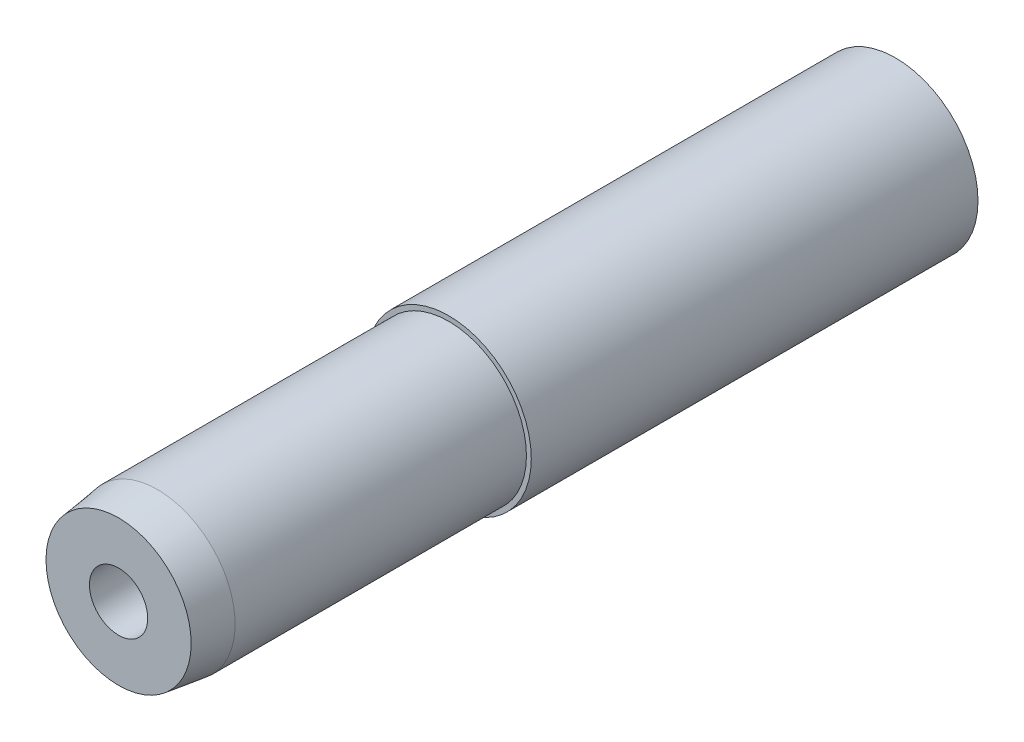
ISO-10303-21;
HEADER;
FILE_DESCRIPTION(('STEP AP214'),'2;1');
FILE_NAME('part.step','',(''),(''),'','','');
FILE_SCHEMA(('AUTOMOTIVE_DESIGN { 1 0 10303 214 1 1 1 1 }'));
ENDSEC;
DATA;
#1=APPLICATION_CONTEXT('core data for automotive mechanical design processes');
#2=APPLICATION_PROTOCOL_DEFINITION('international standard','automotive_design',2000,#1);
#3=PRODUCT_CONTEXT('',#1,'mechanical');
#4=PRODUCT('Part','Part','',(#3));
#5=PRODUCT_RELATED_PRODUCT_CATEGORY('part','',(#4));
#6=PRODUCT_DEFINITION_FORMATION('','',#4);
#7=PRODUCT_DEFINITION_CONTEXT('part definition',#1,'design');
#8=PRODUCT_DEFINITION('design','',#6,#7);
#9=PRODUCT_DEFINITION_SHAPE('','',#8);
#10=(LENGTH_UNIT() NAMED_UNIT(*) SI_UNIT(.MILLI.,.METRE.));
#11=(NAMED_UNIT(*) PLANE_ANGLE_UNIT() SI_UNIT($,.RADIAN.));
#12=(NAMED_UNIT(*) SI_UNIT($,.STERADIAN.) SOLID_ANGLE_UNIT());
#13=UNCERTAINTY_MEASURE_WITH_UNIT(LENGTH_MEASURE(1.E-05),#10,'distance_accuracy_value','');
#14=(GEOMETRIC_REPRESENTATION_CONTEXT(3) GLOBAL_UNCERTAINTY_ASSIGNED_CONTEXT((#13)) GLOBAL_UNIT_ASSIGNED_CONTEXT((#10,
#11,#12)) REPRESENTATION_CONTEXT('',''));
#15=CARTESIAN_POINT('',(0.,0.,0.));
#16=DIRECTION('',(0.,0.,1.));
#17=DIRECTION('',(1.,0.,0.));
#18=AXIS2_PLACEMENT_3D('',#15,#16,#17);
#19=CARTESIAN_POINT('',(0.,0.,80.));
#20=DIRECTION('',(0.,0.,-1.));
#21=DIRECTION('',(-1.,0.,0.));
#22=AXIS2_PLACEMENT_3D('',#19,#20,#21);
#23=CYLINDRICAL_SURFACE('',#22,8.);
#24=CARTESIAN_POINT('',(0.,0.,46.));
#25=DIRECTION('',(0.,0.,1.));
#26=DIRECTION('',(1.,0.,0.));
#27=AXIS2_PLACEMENT_3D('',#24,#25,#26);
#28=CIRCLE('',#27,8.);
#29=CARTESIAN_POINT('',(8.,0.,46.));
#30=VERTEX_POINT('',#29);
#31=EDGE_CURVE('E116',#30,#30,#28,.T.);
#32=ORIENTED_EDGE('',*,*,#31,.T.);
#33=EDGE_LOOP('',(#32));
#34=FACE_BOUND('',#33,.T.);
#35=CARTESIAN_POINT('',(-5.5,5.80947501931113,75.25));
#36=CARTESIAN_POINT('',(-5.4999973647925,5.80947658831576,75.2724446367658));
#37=CARTESIAN_POINT('',(-5.50075632621254,5.80875906671293,75.2948762557681));
#38=CARTESIAN_POINT('',(-5.50376543930061,5.80590841523433,75.3395358589933));
#39=CARTESIAN_POINT('',(-5.50601472108675,5.8037761111489,75.3617639543419));
#40=CARTESIAN_POINT('',(-5.51490417097432,5.7953344714022,75.4275662420129));
#41=CARTESIAN_POINT('',(-5.52368708601938,5.78697955540515,75.4706196402466));
#42=CARTESIAN_POINT('',(-5.54631858939585,5.76529183890183,75.5539009904716));
#43=CARTESIAN_POINT('',(-5.56015731154863,5.75196873255287,75.594134264773));
#44=CARTESIAN_POINT('',(-5.59205062697002,5.72096716449756,75.6711529417533));
#45=CARTESIAN_POINT('',(-5.6101128100044,5.70328085872126,75.7079319682013));
#46=CARTESIAN_POINT('',(-5.65626082621989,5.65756897214208,75.7894272735963));
#47=CARTESIAN_POINT('',(-5.68566420753115,5.62807445098651,75.8325717520733));
#48=CARTESIAN_POINT('',(-5.74839334346837,5.5639909502419,75.9115441060554));
#49=CARTESIAN_POINT('',(-5.78172393019709,5.52939568117344,75.9473628164621));
#50=CARTESIAN_POINT('',(-5.86460775958792,5.44162744215559,76.0250311997331));
#51=CARTESIAN_POINT('',(-5.91529932689124,5.38657419925756,76.0635237072452));
#52=CARTESIAN_POINT('',(-6.01847367949334,5.27105509703498,76.1285637993737));
#53=CARTESIAN_POINT('',(-6.07096342133354,5.2105662805385,76.1550575636223));
#54=CARTESIAN_POINT('',(-6.15571574808617,5.10976620097672,76.1895141315093));
#55=CARTESIAN_POINT('',(-6.18805464688915,5.07056202152812,76.2006904605034));
#56=CARTESIAN_POINT('',(-6.25240238325326,4.99099992871494,76.2194427810981));
#57=CARTESIAN_POINT('',(-6.28441103650216,4.95064141398102,76.2270168584481));
#58=CARTESIAN_POINT('',(-6.34744619222707,4.86955122263275,76.2388089344467));
#59=CARTESIAN_POINT('',(-6.37848005531457,4.82883123783663,76.2430693267744));
#60=CARTESIAN_POINT('',(-6.43981305779877,4.74672940593479,76.2486592246154));
#61=CARTESIAN_POINT('',(-6.47011316396406,4.70534856402822,76.2499928204323));
#62=CARTESIAN_POINT('',(-6.5,4.66368952654441,76.25));
#63=B_SPLINE_CURVE_WITH_KNOTS('',3,(#35,#36,#37,#38,#39,#40,#41,#42,#43,#44,#45,#46,#47,#48,#49,
#50,#51,#52,#53,#54,#55,#56,#57,#58,#59,#60,#61,#62),.UNSPECIFIED.,.F.,.F.,(4,2,2,2,2,2,2,2,2,2,
2,2,2,4),(0.,0.0672846939769787,0.134530149251682,0.267953738167259,0.401118335746273,
0.534524101134662,0.713434469080135,0.89256731661171,1.14365776870358,1.39586359545443,
1.55184181425489,1.70790282813128,1.86193284181685,2.01574745555464),.UNSPECIFIED.);
#64=CARTESIAN_POINT('',(-5.5,5.80947501931113,75.25));
#65=VERTEX_POINT('',#64);
#66=CARTESIAN_POINT('',(-5.83856217223385,5.46911252041499,76.));
#67=VERTEX_POINT('',#66);
#68=EDGE_CURVE('E149',#65,#67,#63,.T.);
#69=ORIENTED_EDGE('',*,*,#68,.T.);
#70=CARTESIAN_POINT('',(0.,0.,76.));
#71=DIRECTION('',(0.,0.,1.));
#72=DIRECTION('',(1.,0.,0.));
#73=AXIS2_PLACEMENT_3D('',#70,#71,#72);
#74=CIRCLE('',#73,8.);
#75=CARTESIAN_POINT('',(-5.83856217223385,-5.46911252041499,76.));
#76=VERTEX_POINT('',#75);
#77=EDGE_CURVE('E188',#67,#76,#74,.F.);
#78=ORIENTED_EDGE('',*,*,#77,.T.);
#79=CARTESIAN_POINT('',(-6.5,-4.66368952654441,76.25));
#80=CARTESIAN_POINT('',(-6.46083609057357,-4.71828907133576,76.2499787062808));
#81=CARTESIAN_POINT('',(-6.42093978679341,-4.77242759041314,76.2476955807502));
#82=CARTESIAN_POINT('',(-6.33985607230395,-4.87962342509187,76.2379482765124));
#83=CARTESIAN_POINT('',(-6.29866369736904,-4.93267484247683,76.2304610385371));
#84=CARTESIAN_POINT('',(-6.21489914513631,-5.03781893417603,76.2094820524937));
#85=CARTESIAN_POINT('',(-6.17231555926465,-5.08988563380799,76.1959027011659));
#86=CARTESIAN_POINT('',(-6.0870690509846,-5.19152910468347,76.1619156028716));
#87=CARTESIAN_POINT('',(-6.04440647263203,-5.24111078346858,76.1415219777241));
#88=CARTESIAN_POINT('',(-5.96064244666235,-5.33616684258341,76.0934342739333));
#89=CARTESIAN_POINT('',(-5.91952674136761,-5.38170145652273,76.0658866075317));
#90=CARTESIAN_POINT('',(-5.83946717646799,-5.46846269991221,76.0025214948016));
#91=CARTESIAN_POINT('',(-5.80051520527707,-5.50970600842134,75.9667379468042));
#92=CARTESIAN_POINT('',(-5.73266647900596,-5.58019010290523,75.8928674655147));
#93=CARTESIAN_POINT('',(-5.70317492404397,-5.61028621403409,75.8561538839581));
#94=CARTESIAN_POINT('',(-5.64834718922158,-5.66548186253002,75.7763304058402));
#95=CARTESIAN_POINT('',(-5.62300848999039,-5.69058443126945,75.7332244177589));
#96=CARTESIAN_POINT('',(-5.58253707774358,-5.73026413770207,75.6499682632775));
#97=CARTESIAN_POINT('',(-5.56637885103154,-5.74593687067846,75.6108410796674));
#98=CARTESIAN_POINT('',(-5.53887387819063,-5.7724554570499,75.5294188706917));
#99=CARTESIAN_POINT('',(-5.5275182346051,-5.78331023823785,75.4871298756682));
#100=CARTESIAN_POINT('',(-5.51273499936769,-5.79739856551107,75.4122924239087));
#101=CARTESIAN_POINT('',(-5.50798942726233,-5.80190366085101,75.3802361476641));
#102=CARTESIAN_POINT('',(-5.50160821950439,-5.8079524789656,75.3154639466623));
#103=CARTESIAN_POINT('',(-5.49998011332773,-5.80948903203296,75.2827466172152));
#104=CARTESIAN_POINT('',(-5.5,-5.80947501931113,75.25));
#105=B_SPLINE_CURVE_WITH_KNOTS('',3,(#79,#80,#81,#82,#83,#84,#85,#86,#87,#88,#89,#90,#91,#92,
#93,#94,#95,#96,#97,#98,#99,#100,#101,#102,#103,#104),.UNSPECIFIED.,.F.,.F.,(4,2,2,2,2,2,2,2,2,
2,2,2,4),(0.,0.201615295695545,0.404129685671124,0.609654475132622,0.814755952231671,
1.01595182800877,1.21633395327743,1.38338293916837,1.55033020499172,1.6852059036034,
1.81983061976126,1.91770691416532,2.01581930808139),.UNSPECIFIED.);
#106=CARTESIAN_POINT('',(-5.5,-5.80947501931113,75.25));
#107=VERTEX_POINT('',#106);
#108=EDGE_CURVE('E159',#76,#107,#105,.T.);
#109=ORIENTED_EDGE('',*,*,#108,.T.);
#110=DIRECTION('',(0.,0.,-1.));
#111=VECTOR('',#110,1.);
#112=CARTESIAN_POINT('',(-5.5,-5.80947501931113,80.));
#113=LINE('',#112,#111);
#114=CARTESIAN_POINT('',(-5.5,-5.80947501931113,52.));
#115=VERTEX_POINT('',#114);
#116=EDGE_CURVE('E127',#115,#107,#113,.F.);
#117=ORIENTED_EDGE('',*,*,#116,.F.);
#118=CARTESIAN_POINT('',(-5.5,-5.80947501931113,52.));
#119=CARTESIAN_POINT('',(-5.4999973647925,-5.80947658831575,51.9775553632342));
#120=CARTESIAN_POINT('',(-5.50075632621254,-5.80875906671292,51.9551237442319));
#121=CARTESIAN_POINT('',(-5.50376543930062,-5.80590841523432,51.9104641410067));
#122=CARTESIAN_POINT('',(-5.50601472108675,-5.8037761111489,51.8882360456581));
#123=CARTESIAN_POINT('',(-5.51490417097433,-5.7953344714022,51.8224337579871));
#124=CARTESIAN_POINT('',(-5.52368708601939,-5.78697955540514,51.7793803597534));
#125=CARTESIAN_POINT('',(-5.54631858939585,-5.76529183890183,51.6960990095284));
#126=CARTESIAN_POINT('',(-5.56015731154863,-5.75196873255287,51.655865735227));
#127=CARTESIAN_POINT('',(-5.59205062697003,-5.72096716449755,51.5788470582467));
#128=CARTESIAN_POINT('',(-5.61011281000441,-5.70328085872126,51.5420680317987));
#129=CARTESIAN_POINT('',(-5.65626082621989,-5.65756897214208,51.4605727264037));
#130=CARTESIAN_POINT('',(-5.68566420753115,-5.62807445098651,51.4174282479267));
#131=CARTESIAN_POINT('',(-5.74839334346838,-5.5639909502419,51.3384558939446));
#132=CARTESIAN_POINT('',(-5.78172393019709,-5.52939568117343,51.3026371835379));
#133=CARTESIAN_POINT('',(-5.86460775958793,-5.44162744215558,51.2249688002668));
#134=CARTESIAN_POINT('',(-5.91529932689125,-5.38657419925755,51.1864762927547));
#135=CARTESIAN_POINT('',(-6.01847367949335,-5.27105509703496,51.1214362006263));
#136=CARTESIAN_POINT('',(-6.07096342133355,-5.21056628053848,51.0949424363777));
#137=CARTESIAN_POINT('',(-6.15571574808618,-5.10976620097671,51.0604858684907));
#138=CARTESIAN_POINT('',(-6.18805464688916,-5.07056202152811,51.0493095394966));
#139=CARTESIAN_POINT('',(-6.25240238325327,-4.99099992871493,51.0305572189019));
#140=CARTESIAN_POINT('',(-6.28441103650216,-4.95064141398101,51.0229831415519));
#141=CARTESIAN_POINT('',(-6.34744619222707,-4.86955122263274,51.0111910655533));
#142=CARTESIAN_POINT('',(-6.37848005531458,-4.82883123783662,51.0069306732256));
#143=CARTESIAN_POINT('',(-6.43981305779878,-4.74672940593478,51.0013407753846));
#144=CARTESIAN_POINT('',(-6.47011316396407,-4.70534856402822,51.0000071795677));
#145=CARTESIAN_POINT('',(-6.5,-4.66368952654441,51.));
#146=B_SPLINE_CURVE_WITH_KNOTS('',3,(#118,#119,#120,#121,#122,#123,#124,#125,#126,#127,#128,
#129,#130,#131,#132,#133,#134,#135,#136,#137,#138,#139,#140,#141,#142,#143,#144,#145),
.UNSPECIFIED.,.F.,.F.,(4,2,2,2,2,2,2,2,2,2,2,2,2,4),(0.,0.0672846939769926,0.134530149251696,
0.26795373816726,0.401118335746267,0.534524101134662,0.713434469080133,0.892567316611714,
1.14365776870359,1.39586359545444,1.5518418142549,1.70790282813128,1.86193284181686,
2.01574745555464),.UNSPECIFIED.);
#147=CARTESIAN_POINT('',(-6.5,-4.66368952654441,51.));
#148=VERTEX_POINT('',#147);
#149=EDGE_CURVE('E201',#115,#148,#146,.T.);
#150=ORIENTED_EDGE('',*,*,#149,.T.);
#151=CARTESIAN_POINT('',(0.,0.,51.));
#152=DIRECTION('',(0.,0.,-1.));
#153=DIRECTION('',(-1.,0.,0.));
#154=AXIS2_PLACEMENT_3D('',#151,#152,#153);
#155=CIRCLE('',#154,8.);
#156=CARTESIAN_POINT('',(-6.5,4.66368952654441,51.));
#157=VERTEX_POINT('',#156);
#158=EDGE_CURVE('E119',#148,#157,#155,.T.);
#159=ORIENTED_EDGE('',*,*,#158,.T.);
#160=CARTESIAN_POINT('',(-6.5,4.66368952654441,51.));
#161=CARTESIAN_POINT('',(-6.46083609057357,4.71828907133576,51.0000212937192));
#162=CARTESIAN_POINT('',(-6.42093978679341,4.77242759041314,51.0023044192498));
#163=CARTESIAN_POINT('',(-6.33985607230395,4.87962342509187,51.0120517234876));
#164=CARTESIAN_POINT('',(-6.29866369736905,4.93267484247682,51.0195389614629));
#165=CARTESIAN_POINT('',(-6.21489914513631,5.03781893417603,51.0405179475063));
#166=CARTESIAN_POINT('',(-6.17231555926465,5.08988563380799,51.0540972988341));
#167=CARTESIAN_POINT('',(-6.08706905098461,5.19152910468347,51.0880843971284));
#168=CARTESIAN_POINT('',(-6.04440647263203,5.24111078346858,51.1084780222759));
#169=CARTESIAN_POINT('',(-5.96064244666236,5.33616684258341,51.1565657260667));
#170=CARTESIAN_POINT('',(-5.91952674136761,5.38170145652272,51.1841133924683));
#171=CARTESIAN_POINT('',(-5.839467176468,5.46846269991221,51.2474785051984));
#172=CARTESIAN_POINT('',(-5.80051520527707,5.50970600842133,51.2832620531958));
#173=CARTESIAN_POINT('',(-5.73266647900596,5.58019010290523,51.3571325344853));
#174=CARTESIAN_POINT('',(-5.70317492404397,5.61028621403408,51.3938461160419));
#175=CARTESIAN_POINT('',(-5.64834718922159,5.66548186253002,51.4736695941598));
#176=CARTESIAN_POINT('',(-5.62300848999039,5.69058443126945,51.5167755822411));
#177=CARTESIAN_POINT('',(-5.58253707774357,5.73026413770207,51.6000317367225));
#178=CARTESIAN_POINT('',(-5.56637885103154,5.74593687067847,51.6391589203326));
#179=CARTESIAN_POINT('',(-5.53887387819063,5.7724554570499,51.7205811293084));
#180=CARTESIAN_POINT('',(-5.5275182346051,5.78331023823785,51.7628701243319));
#181=CARTESIAN_POINT('',(-5.5127349993677,5.79739856551107,51.8377075760913));
#182=CARTESIAN_POINT('',(-5.50798942726233,5.80190366085101,51.8697638523359));
#183=CARTESIAN_POINT('',(-5.50160821950439,5.8079524789656,51.9345360533377));
#184=CARTESIAN_POINT('',(-5.49998011332773,5.80948903203296,51.9672533827848));
#185=CARTESIAN_POINT('',(-5.5,5.80947501931113,52.));
#186=B_SPLINE_CURVE_WITH_KNOTS('',3,(#160,#161,#162,#163,#164,#165,#166,#167,#168,#169,#170,
#171,#172,#173,#174,#175,#176,#177,#178,#179,#180,#181,#182,#183,#184,#185),.UNSPECIFIED.,.F.,
.F.,(4,2,2,2,2,2,2,2,2,2,2,2,4),(0.,0.201615295695545,0.404129685671123,0.609654475132619,
0.814755952231669,1.01595182800876,1.21633395327743,1.38338293916837,1.55033020499173,
1.68520590360344,1.81983061976128,1.91770691416533,2.01581930808141),.UNSPECIFIED.);
#187=CARTESIAN_POINT('',(-5.5,5.80947501931113,52.));
#188=VERTEX_POINT('',#187);
#189=EDGE_CURVE('E203',#157,#188,#186,.T.);
#190=ORIENTED_EDGE('',*,*,#189,.T.);
#191=DIRECTION('',(0.,0.,-1.));
#192=VECTOR('',#191,1.);
#193=CARTESIAN_POINT('',(-5.5,5.80947501931113,80.));
#194=LINE('',#193,#192);
#195=EDGE_CURVE('E131',#65,#188,#194,.T.);
#196=ORIENTED_EDGE('',*,*,#195,.F.);
#197=EDGE_LOOP('',(#69,#78,#109,#117,#150,#159,#190,#196));
#198=FACE_BOUND('',#197,.T.);
#199=ADVANCED_FACE('F47',(#34,#198),#23,.T.);
#200=CARTESIAN_POINT('',(0.,0.,70.0416305603426));
#201=DIRECTION('',(0.,0.,-1.));
#202=DIRECTION('',(-1.,0.,0.));
#203=AXIS2_PLACEMENT_3D('',#200,#201,#202);
#204=CYLINDRICAL_SURFACE('',#203,8.50000000000001);
#205=CARTESIAN_POINT('',(0.,0.,0.));
#206=DIRECTION('',(0.,0.,1.));
#207=DIRECTION('',(1.,0.,0.));
#208=AXIS2_PLACEMENT_3D('',#205,#206,#207);
#209=CIRCLE('',#208,8.50000000000001);
#210=CARTESIAN_POINT('',(8.50000000000001,0.,0.));
#211=VERTEX_POINT('',#210);
#212=EDGE_CURVE('E105',#211,#211,#209,.T.);
#213=ORIENTED_EDGE('',*,*,#212,.T.);
#214=EDGE_LOOP('',(#213));
#215=FACE_BOUND('',#214,.T.);
#216=CARTESIAN_POINT('',(0.,0.,46.));
#217=DIRECTION('',(0.,0.,1.));
#218=DIRECTION('',(1.,0.,0.));
#219=AXIS2_PLACEMENT_3D('',#216,#217,#218);
#220=CIRCLE('',#219,8.50000000000001);
#221=CARTESIAN_POINT('',(8.50000000000001,0.,46.));
#222=VERTEX_POINT('',#221);
#223=EDGE_CURVE('E111',#222,#222,#220,.T.);
#224=ORIENTED_EDGE('',*,*,#223,.F.);
#225=EDGE_LOOP('',(#224));
#226=FACE_BOUND('',#225,.T.);
#227=ADVANCED_FACE('F234',(#215,#226),#204,.T.);
#228=CARTESIAN_POINT('',(0.,0.,0.));
#229=DIRECTION('',(0.,0.,1.));
#230=DIRECTION('',(1.,0.,0.));
#231=AXIS2_PLACEMENT_3D('',#228,#229,#230);
#232=PLANE('',#231);
#233=ORIENTED_EDGE('',*,*,#212,.F.);
#234=EDGE_LOOP('',(#233));
#235=FACE_BOUND('',#234,.T.);
#236=ADVANCED_FACE('F230',(#235),#232,.F.);
#237=CARTESIAN_POINT('',(0.,0.,46.));
#238=DIRECTION('',(0.,0.,1.));
#239=DIRECTION('',(1.,0.,0.));
#240=AXIS2_PLACEMENT_3D('',#237,#238,#239);
#241=PLANE('',#240);
#242=ORIENTED_EDGE('',*,*,#31,.F.);
#243=EDGE_LOOP('',(#242));
#244=FACE_BOUND('',#243,.T.);
#245=ORIENTED_EDGE('',*,*,#223,.T.);
#246=EDGE_LOOP('',(#245));
#247=FACE_BOUND('',#246,.T.);
#248=ADVANCED_FACE('F174',(#244,#247),#241,.T.);
#249=CARTESIAN_POINT('',(0.,0.,80.));
#250=DIRECTION('',(0.,0.,1.));
#251=DIRECTION('',(1.,0.,0.));
#252=AXIS2_PLACEMENT_3D('',#249,#250,#251);
#253=PLANE('',#252);
#254=CARTESIAN_POINT('',(0.,0.,80.));
#255=DIRECTION('',(0.,0.,1.));
#256=DIRECTION('',(1.,0.,0.));
#257=AXIS2_PLACEMENT_3D('',#254,#255,#256);
#258=CIRCLE('',#257,3.);
#259=CARTESIAN_POINT('',(3.,0.,80.));
#260=VERTEX_POINT('',#259);
#261=EDGE_CURVE('E106',#260,#260,#258,.T.);
#262=ORIENTED_EDGE('',*,*,#261,.F.);
#263=EDGE_LOOP('',(#262));
#264=FACE_BOUND('',#263,.T.);
#265=CARTESIAN_POINT('',(0.,0.,80.));
#266=DIRECTION('',(0.,0.,1.));
#267=DIRECTION('',(1.,0.,0.));
#268=AXIS2_PLACEMENT_3D('',#265,#266,#267);
#269=CIRCLE('',#268,7.47339000965039);
#270=CARTESIAN_POINT('',(7.47339000965039,0.,80.));
#271=VERTEX_POINT('',#270);
#272=EDGE_CURVE('E198',#271,#271,#269,.T.);
#273=ORIENTED_EDGE('',*,*,#272,.T.);
#274=EDGE_LOOP('',(#273));
#275=FACE_BOUND('',#274,.T.);
#276=ADVANCED_FACE('F221',(#264,#275),#253,.T.);
#277=CARTESIAN_POINT('',(-5.50000000000001,-8.50000000000001,0.));
#278=DIRECTION('',(-1.,0.,0.));
#279=DIRECTION('',(0.,0.,1.));
#280=AXIS2_PLACEMENT_3D('',#277,#278,#279);
#281=PLANE('',#280);
#282=ORIENTED_EDGE('',*,*,#116,.T.);
#283=DIRECTION('',(0.,1.,0.));
#284=VECTOR('',#283,1.);
#285=CARTESIAN_POINT('',(-5.5,5.80947501931113,75.25));
#286=LINE('',#285,#284);
#287=EDGE_CURVE('E138',#107,#65,#286,.T.);
#288=ORIENTED_EDGE('',*,*,#287,.T.);
#289=ORIENTED_EDGE('',*,*,#195,.T.);
#290=DIRECTION('',(0.,1.,0.));
#291=VECTOR('',#290,1.);
#292=CARTESIAN_POINT('',(-5.5,-8.50000000000001,52.));
#293=LINE('',#292,#291);
#294=EDGE_CURVE('E135',#188,#115,#293,.F.);
#295=ORIENTED_EDGE('',*,*,#294,.T.);
#296=EDGE_LOOP('',(#282,#288,#289,#295));
#297=FACE_BOUND('',#296,.T.);
#298=ADVANCED_FACE('F212',(#297),#281,.T.);
#299=CARTESIAN_POINT('',(0.,-8.50000000000001,76.25));
#300=DIRECTION('',(0.,0.,-1.));
#301=DIRECTION('',(-1.,0.,0.));
#302=AXIS2_PLACEMENT_3D('',#299,#300,#301);
#303=PLANE('',#302);
#304=DIRECTION('',(0.,1.,0.));
#305=VECTOR('',#304,1.);
#306=CARTESIAN_POINT('',(-6.5,-5.80947501931113,76.25));
#307=LINE('',#306,#305);
#308=CARTESIAN_POINT('',(-6.5,4.60700263548959,76.25));
#309=VERTEX_POINT('',#308);
#310=CARTESIAN_POINT('',(-6.5,-4.60700263548959,76.25));
#311=VERTEX_POINT('',#310);
#312=EDGE_CURVE('E142',#309,#311,#307,.F.);
#313=ORIENTED_EDGE('',*,*,#312,.T.);
#314=CARTESIAN_POINT('',(0.,0.,76.25));
#315=DIRECTION('',(0.,0.,-1.));
#316=DIRECTION('',(-1.,0.,0.));
#317=AXIS2_PLACEMENT_3D('',#314,#315,#316);
#318=CIRCLE('',#317,7.96708687560315);
#319=EDGE_CURVE('E11',#311,#309,#318,.T.);
#320=ORIENTED_EDGE('',*,*,#319,.T.);
#321=EDGE_LOOP('',(#313,#320));
#322=FACE_BOUND('',#321,.T.);
#323=ADVANCED_FACE('F227',(#322),#303,.T.);
#324=CARTESIAN_POINT('',(0.,-8.50000000000001,51.));
#325=DIRECTION('',(0.,0.,-1.));
#326=DIRECTION('',(-1.,0.,0.));
#327=AXIS2_PLACEMENT_3D('',#324,#325,#326);
#328=PLANE('',#327);
#329=ORIENTED_EDGE('',*,*,#158,.F.);
#330=DIRECTION('',(0.,1.,0.));
#331=VECTOR('',#330,1.);
#332=CARTESIAN_POINT('',(-6.5,-8.50000000000001,51.));
#333=LINE('',#332,#331);
#334=EDGE_CURVE('E145',#148,#157,#333,.T.);
#335=ORIENTED_EDGE('',*,*,#334,.T.);
#336=EDGE_LOOP('',(#329,#335));
#337=FACE_BOUND('',#336,.T.);
#338=ADVANCED_FACE('F173',(#337),#328,.F.);
#339=CARTESIAN_POINT('',(-6.5,-8.50000000000001,75.25));
#340=DIRECTION('',(0.,-1.,0.));
#341=DIRECTION('',(0.,0.,-1.));
#342=AXIS2_PLACEMENT_3D('',#339,#340,#341);
#343=CYLINDRICAL_SURFACE('',#342,1.);
#344=ORIENTED_EDGE('',*,*,#108,.F.);
#345=CARTESIAN_POINT('',(-5.83856217223385,-5.46911252041499,76.));
#346=CARTESIAN_POINT('',(-5.86799494050393,-5.43270661784496,76.0259374061487));
#347=CARTESIAN_POINT('',(-5.89819574801135,-5.39531765487576,76.0495160182516));
#348=CARTESIAN_POINT('',(-5.9595952599816,-5.31896930855494,76.0922387139811));
#349=CARTESIAN_POINT('',(-5.99079229985178,-5.28001251914367,76.1113897952185));
#350=CARTESIAN_POINT('',(-6.05321333540265,-5.20147251215895,76.1453330568762));
#351=CARTESIAN_POINT('',(-6.08442804685764,-5.16191086110199,76.1601931524903));
#352=CARTESIAN_POINT('',(-6.14707591861646,-5.08176024021794,76.1862666615292));
#353=CARTESIAN_POINT('',(-6.17850914722816,-5.04117093761138,76.1974788769694));
#354=CARTESIAN_POINT('',(-6.25853586641411,-4.93668521157746,76.2217423486659));
#355=CARTESIAN_POINT('',(-6.3070902209545,-4.87220982376788,76.232432250325));
#356=CARTESIAN_POINT('',(-6.40402815422781,-4.74097734778193,76.2465946071858));
#357=CARTESIAN_POINT('',(-6.45240073643376,-4.67420126589584,76.2499684815867));
#358=CARTESIAN_POINT('',(-6.49999999999876,-4.60700263549001,76.2500000000059));
#359=B_SPLINE_CURVE_WITH_KNOTS('',3,(#345,#346,#347,#348,#349,#350,#351,#352,#353,#354,#355,
#356,#357,#358),.UNSPECIFIED.,.F.,.F.,(4,2,2,2,2,2,4),(0.,0.160419498364899,0.320583697184987,
0.478053220136585,0.635574404902048,0.87944848408293,1.12658877097552),.UNSPECIFIED.);
#360=EDGE_CURVE('E58',#76,#311,#359,.T.);
#361=ORIENTED_EDGE('',*,*,#360,.T.);
#362=ORIENTED_EDGE('',*,*,#312,.F.);
#363=CARTESIAN_POINT('',(-6.5,4.60700263548959,76.25));
#364=CARTESIAN_POINT('',(-6.456620869937,4.66823307366911,76.2499767268161));
#365=CARTESIAN_POINT('',(-6.41262187228359,4.72909503242722,76.2471730646925));
#366=CARTESIAN_POINT('',(-6.32370099709181,4.84990396906494,76.2353693738439));
#367=CARTESIAN_POINT('',(-6.27877609458554,4.90984622057701,76.2263441976401));
#368=CARTESIAN_POINT('',(-6.18994452513167,5.02647414066534,76.201801064729));
#369=CARTESIAN_POINT('',(-6.14604463795755,5.08320399408487,76.1864723047746));
#370=CARTESIAN_POINT('',(-6.05879614164727,5.19453521468054,76.1486630649137));
#371=CARTESIAN_POINT('',(-6.01544658663654,5.24914070809166,76.1261973151916));
#372=CARTESIAN_POINT('',(-5.94997949007452,5.33094112737989,76.0855843833465));
#373=CARTESIAN_POINT('',(-5.9273263260217,5.35911897333197,76.0702554071821));
#374=CARTESIAN_POINT('',(-5.88249029848512,5.41475327276634,76.0370602272716));
#375=CARTESIAN_POINT('',(-5.86031223660251,5.44220273065101,76.0191758562705));
#376=CARTESIAN_POINT('',(-5.83856217223385,5.46911252041498,76.));
#377=B_SPLINE_CURVE_WITH_KNOTS('',3,(#363,#364,#365,#366,#367,#368,#369,#370,#371,#372,#373,
#374,#375,#376),.UNSPECIFIED.,.F.,.F.,(4,2,2,2,2,2,4),(0.,0.22515329133215,0.451222034184282,
0.670950413514603,0.890228205326764,1.00795720493671,1.12656918750642),.UNSPECIFIED.);
#378=EDGE_CURVE('E181',#309,#67,#377,.T.);
#379=ORIENTED_EDGE('',*,*,#378,.T.);
#380=ORIENTED_EDGE('',*,*,#68,.F.);
#381=ORIENTED_EDGE('',*,*,#287,.F.);
#382=EDGE_LOOP('',(#344,#361,#362,#379,#380,#381));
#383=FACE_BOUND('',#382,.T.);
#384=ADVANCED_FACE('F168',(#383),#343,.F.);
#385=CARTESIAN_POINT('',(-6.5,-8.50000000000001,52.));
#386=DIRECTION('',(0.,1.,0.));
#387=DIRECTION('',(0.,0.,1.));
#388=AXIS2_PLACEMENT_3D('',#385,#386,#387);
#389=CYLINDRICAL_SURFACE('',#388,1.);
#390=ORIENTED_EDGE('',*,*,#149,.F.);
#391=ORIENTED_EDGE('',*,*,#294,.F.);
#392=ORIENTED_EDGE('',*,*,#189,.F.);
#393=ORIENTED_EDGE('',*,*,#334,.F.);
#394=EDGE_LOOP('',(#390,#391,#392,#393));
#395=FACE_BOUND('',#394,.T.);
#396=ADVANCED_FACE('F172',(#395),#389,.F.);
#397=CARTESIAN_POINT('',(0.,0.,80.));
#398=DIRECTION('',(0.,0.,-1.));
#399=DIRECTION('',(-1.,0.,0.));
#400=AXIS2_PLACEMENT_3D('',#397,#398,#399);
#401=CONICAL_SURFACE('',#400,7.47339000965039,0.130899693899582);
#402=ORIENTED_EDGE('',*,*,#360,.F.);
#403=ORIENTED_EDGE('',*,*,#77,.F.);
#404=ORIENTED_EDGE('',*,*,#378,.F.);
#405=ORIENTED_EDGE('',*,*,#319,.F.);
#406=EDGE_LOOP('',(#402,#403,#404,#405));
#407=FACE_BOUND('',#406,.T.);
#408=ORIENTED_EDGE('',*,*,#272,.F.);
#409=EDGE_LOOP('',(#408));
#410=FACE_BOUND('',#409,.T.);
#411=ADVANCED_FACE('F50',(#407,#410),#401,.T.);
#412=CARTESIAN_POINT('',(0.,0.,47.8025818570827));
#413=DIRECTION('',(0.,0.,1.));
#414=DIRECTION('',(1.,0.,0.));
#415=AXIS2_PLACEMENT_3D('',#412,#413,#414);
#416=CONICAL_SURFACE('',#415,3.,1.02974425867665);
#417=CARTESIAN_POINT('',(0.,0.,46.));
#418=VERTEX_POINT('',#417);
#419=VERTEX_LOOP('',#418);
#420=FACE_BOUND('',#419,.T.);
#421=CARTESIAN_POINT('',(0.,0.,47.8025818570827));
#422=DIRECTION('',(0.,0.,1.));
#423=DIRECTION('',(1.,0.,0.));
#424=AXIS2_PLACEMENT_3D('',#421,#422,#423);
#425=CIRCLE('',#424,3.);
#426=CARTESIAN_POINT('',(3.,0.,47.8025818570827));
#427=VERTEX_POINT('',#426);
#428=EDGE_CURVE('E102',#427,#427,#425,.T.);
#429=ORIENTED_EDGE('',*,*,#428,.T.);
#430=EDGE_LOOP('',(#429));
#431=FACE_BOUND('',#430,.T.);
#432=ADVANCED_FACE('F95',(#420,#431),#416,.F.);
#433=CARTESIAN_POINT('',(0.,0.,80.));
#434=DIRECTION('',(0.,0.,1.));
#435=DIRECTION('',(1.,0.,0.));
#436=AXIS2_PLACEMENT_3D('',#433,#434,#435);
#437=CYLINDRICAL_SURFACE('',#436,3.);
#438=ORIENTED_EDGE('',*,*,#428,.F.);
#439=EDGE_LOOP('',(#438));
#440=FACE_BOUND('',#439,.T.);
#441=ORIENTED_EDGE('',*,*,#261,.T.);
#442=EDGE_LOOP('',(#441));
#443=FACE_BOUND('',#442,.T.);
#444=ADVANCED_FACE('F98',(#440,#443),#437,.F.);
#445=CLOSED_SHELL('',(#199,#227,#236,#248,#276,#298,#323,#338,#384,#396,#411,#432,#444));
#446=MANIFOLD_SOLID_BREP('B2',#445);
#447=ADVANCED_BREP_SHAPE_REPRESENTATION('',(#18,#446),#14);
#448=SHAPE_DEFINITION_REPRESENTATION(#9,#447);
ENDSEC;
END-ISO-10303-21;
